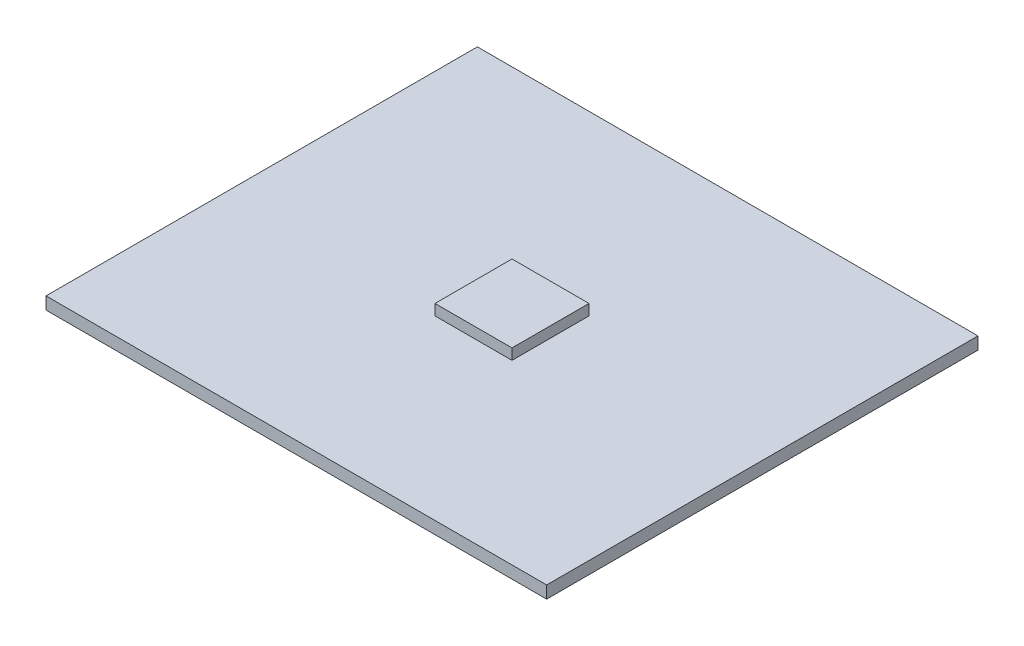
ISO-10303-21;
HEADER;
FILE_DESCRIPTION(('STEP AP214'),'2;1');
FILE_NAME('part.step','',(''),(''),'','','');
FILE_SCHEMA(('AUTOMOTIVE_DESIGN { 1 0 10303 214 1 1 1 1 }'));
ENDSEC;
DATA;
#1=APPLICATION_CONTEXT('core data for automotive mechanical design processes');
#2=APPLICATION_PROTOCOL_DEFINITION('international standard','automotive_design',2000,#1);
#3=PRODUCT_CONTEXT('',#1,'mechanical');
#4=PRODUCT('Part','Part','',(#3));
#5=PRODUCT_RELATED_PRODUCT_CATEGORY('part','',(#4));
#6=PRODUCT_DEFINITION_FORMATION('','',#4);
#7=PRODUCT_DEFINITION_CONTEXT('part definition',#1,'design');
#8=PRODUCT_DEFINITION('design','',#6,#7);
#9=PRODUCT_DEFINITION_SHAPE('','',#8);
#10=(LENGTH_UNIT() NAMED_UNIT(*) SI_UNIT(.MILLI.,.METRE.));
#11=(NAMED_UNIT(*) PLANE_ANGLE_UNIT() SI_UNIT($,.RADIAN.));
#12=(NAMED_UNIT(*) SI_UNIT($,.STERADIAN.) SOLID_ANGLE_UNIT());
#13=UNCERTAINTY_MEASURE_WITH_UNIT(LENGTH_MEASURE(1.E-05),#10,'distance_accuracy_value','');
#14=(GEOMETRIC_REPRESENTATION_CONTEXT(3) GLOBAL_UNCERTAINTY_ASSIGNED_CONTEXT((#13)) GLOBAL_UNIT_ASSIGNED_CONTEXT((#10,
#11,#12)) REPRESENTATION_CONTEXT('',''));
#15=CARTESIAN_POINT('',(0.,0.,0.));
#16=DIRECTION('',(0.,0.,1.));
#17=DIRECTION('',(1.,0.,0.));
#18=AXIS2_PLACEMENT_3D('',#15,#16,#17);
#19=CARTESIAN_POINT('',(0.,1.6,0.));
#20=DIRECTION('',(0.,1.,0.));
#21=DIRECTION('',(0.,0.,1.));
#22=AXIS2_PLACEMENT_3D('',#19,#20,#21);
#23=PLANE('',#22);
#24=DIRECTION('',(0.,0.,1.));
#25=VECTOR('',#24,1.);
#26=CARTESIAN_POINT('',(-32.5,1.6,-28.));
#27=LINE('',#26,#25);
#28=CARTESIAN_POINT('',(-32.5,1.6,-28.));
#29=VERTEX_POINT('',#28);
#30=CARTESIAN_POINT('',(-32.5,1.6,28.));
#31=VERTEX_POINT('',#30);
#32=EDGE_CURVE('E153',#29,#31,#27,.T.);
#33=ORIENTED_EDGE('',*,*,#32,.T.);
#34=DIRECTION('',(1.,0.,0.));
#35=VECTOR('',#34,1.);
#36=CARTESIAN_POINT('',(-32.5,1.6,28.));
#37=LINE('',#36,#35);
#38=CARTESIAN_POINT('',(32.5,1.6,28.));
#39=VERTEX_POINT('',#38);
#40=EDGE_CURVE('E91',#31,#39,#37,.T.);
#41=ORIENTED_EDGE('',*,*,#40,.T.);
#42=DIRECTION('',(0.,0.,-1.));
#43=VECTOR('',#42,1.);
#44=CARTESIAN_POINT('',(32.5,1.6,28.));
#45=LINE('',#44,#43);
#46=CARTESIAN_POINT('',(32.5,1.6,-28.));
#47=VERTEX_POINT('',#46);
#48=EDGE_CURVE('E152',#39,#47,#45,.T.);
#49=ORIENTED_EDGE('',*,*,#48,.T.);
#50=DIRECTION('',(-1.,0.,0.));
#51=VECTOR('',#50,1.);
#52=CARTESIAN_POINT('',(32.5,1.6,-28.));
#53=LINE('',#52,#51);
#54=EDGE_CURVE('E61',#47,#29,#53,.T.);
#55=ORIENTED_EDGE('',*,*,#54,.T.);
#56=EDGE_LOOP('',(#33,#41,#49,#55));
#57=FACE_BOUND('',#56,.T.);
#58=DIRECTION('',(-1.,0.,0.));
#59=VECTOR('',#58,1.);
#60=CARTESIAN_POINT('',(0.,1.6,5.));
#61=LINE('',#60,#59);
#62=CARTESIAN_POINT('',(5.,1.6,5.));
#63=VERTEX_POINT('',#62);
#64=CARTESIAN_POINT('',(-5.,1.6,5.));
#65=VERTEX_POINT('',#64);
#66=EDGE_CURVE('E150',#63,#65,#61,.T.);
#67=ORIENTED_EDGE('',*,*,#66,.T.);
#68=DIRECTION('',(0.,0.,-1.));
#69=VECTOR('',#68,1.);
#70=CARTESIAN_POINT('',(-5.,1.6,0.));
#71=LINE('',#70,#69);
#72=CARTESIAN_POINT('',(-5.,1.6,-5.));
#73=VERTEX_POINT('',#72);
#74=EDGE_CURVE('E136',#65,#73,#71,.T.);
#75=ORIENTED_EDGE('',*,*,#74,.T.);
#76=DIRECTION('',(1.,0.,0.));
#77=VECTOR('',#76,1.);
#78=CARTESIAN_POINT('',(0.,1.6,-5.));
#79=LINE('',#78,#77);
#80=CARTESIAN_POINT('',(5.,1.6,-5.));
#81=VERTEX_POINT('',#80);
#82=EDGE_CURVE('E140',#73,#81,#79,.T.);
#83=ORIENTED_EDGE('',*,*,#82,.T.);
#84=DIRECTION('',(0.,0.,1.));
#85=VECTOR('',#84,1.);
#86=CARTESIAN_POINT('',(5.,1.6,0.));
#87=LINE('',#86,#85);
#88=EDGE_CURVE('E139',#81,#63,#87,.T.);
#89=ORIENTED_EDGE('',*,*,#88,.T.);
#90=EDGE_LOOP('',(#67,#75,#83,#89));
#91=FACE_BOUND('',#90,.T.);
#92=ADVANCED_FACE('F39',(#57,#91),#23,.T.);
#93=CARTESIAN_POINT('',(-32.5,1.6,-28.));
#94=DIRECTION('',(1.,0.,0.));
#95=DIRECTION('',(0.,0.,-1.));
#96=AXIS2_PLACEMENT_3D('',#93,#94,#95);
#97=PLANE('',#96);
#98=DIRECTION('',(0.,0.,1.));
#99=VECTOR('',#98,1.);
#100=CARTESIAN_POINT('',(-32.5,0.,-28.));
#101=LINE('',#100,#99);
#102=CARTESIAN_POINT('',(-32.5,0.,-28.));
#103=VERTEX_POINT('',#102);
#104=CARTESIAN_POINT('',(-32.5,0.,28.));
#105=VERTEX_POINT('',#104);
#106=EDGE_CURVE('E148',#103,#105,#101,.T.);
#107=ORIENTED_EDGE('',*,*,#106,.T.);
#108=DIRECTION('',(0.,-1.,0.));
#109=VECTOR('',#108,1.);
#110=CARTESIAN_POINT('',(-32.5,1.6,28.));
#111=LINE('',#110,#109);
#112=EDGE_CURVE('E11',#31,#105,#111,.T.);
#113=ORIENTED_EDGE('',*,*,#112,.F.);
#114=ORIENTED_EDGE('',*,*,#32,.F.);
#115=DIRECTION('',(0.,-1.,0.));
#116=VECTOR('',#115,1.);
#117=CARTESIAN_POINT('',(-32.5,1.6,-28.));
#118=LINE('',#117,#116);
#119=EDGE_CURVE('E160',#29,#103,#118,.T.);
#120=ORIENTED_EDGE('',*,*,#119,.T.);
#121=EDGE_LOOP('',(#107,#113,#114,#120));
#122=FACE_BOUND('',#121,.T.);
#123=ADVANCED_FACE('F41',(#122),#97,.F.);
#124=CARTESIAN_POINT('',(-32.5,1.6,28.));
#125=DIRECTION('',(0.,0.,-1.));
#126=DIRECTION('',(-1.,0.,0.));
#127=AXIS2_PLACEMENT_3D('',#124,#125,#126);
#128=PLANE('',#127);
#129=DIRECTION('',(1.,0.,0.));
#130=VECTOR('',#129,1.);
#131=CARTESIAN_POINT('',(-32.5,0.,28.));
#132=LINE('',#131,#130);
#133=CARTESIAN_POINT('',(32.5,0.,28.));
#134=VERTEX_POINT('',#133);
#135=EDGE_CURVE('E158',#105,#134,#132,.T.);
#136=ORIENTED_EDGE('',*,*,#135,.T.);
#137=DIRECTION('',(0.,-1.,0.));
#138=VECTOR('',#137,1.);
#139=CARTESIAN_POINT('',(32.5,1.6,28.));
#140=LINE('',#139,#138);
#141=EDGE_CURVE('E50',#39,#134,#140,.T.);
#142=ORIENTED_EDGE('',*,*,#141,.F.);
#143=ORIENTED_EDGE('',*,*,#40,.F.);
#144=ORIENTED_EDGE('',*,*,#112,.T.);
#145=EDGE_LOOP('',(#136,#142,#143,#144));
#146=FACE_BOUND('',#145,.T.);
#147=ADVANCED_FACE('F187',(#146),#128,.F.);
#148=CARTESIAN_POINT('',(32.5,1.6,28.));
#149=DIRECTION('',(-1.,0.,0.));
#150=DIRECTION('',(0.,0.,1.));
#151=AXIS2_PLACEMENT_3D('',#148,#149,#150);
#152=PLANE('',#151);
#153=DIRECTION('',(0.,0.,-1.));
#154=VECTOR('',#153,1.);
#155=CARTESIAN_POINT('',(32.5,0.,28.));
#156=LINE('',#155,#154);
#157=CARTESIAN_POINT('',(32.5,0.,-28.));
#158=VERTEX_POINT('',#157);
#159=EDGE_CURVE('E165',#134,#158,#156,.T.);
#160=ORIENTED_EDGE('',*,*,#159,.T.);
#161=DIRECTION('',(0.,-1.,0.));
#162=VECTOR('',#161,1.);
#163=CARTESIAN_POINT('',(32.5,1.6,-28.));
#164=LINE('',#163,#162);
#165=EDGE_CURVE('E168',#47,#158,#164,.T.);
#166=ORIENTED_EDGE('',*,*,#165,.F.);
#167=ORIENTED_EDGE('',*,*,#48,.F.);
#168=ORIENTED_EDGE('',*,*,#141,.T.);
#169=EDGE_LOOP('',(#160,#166,#167,#168));
#170=FACE_BOUND('',#169,.T.);
#171=ADVANCED_FACE('F173',(#170),#152,.F.);
#172=CARTESIAN_POINT('',(32.5,1.6,-28.));
#173=DIRECTION('',(0.,0.,1.));
#174=DIRECTION('',(1.,0.,0.));
#175=AXIS2_PLACEMENT_3D('',#172,#173,#174);
#176=PLANE('',#175);
#177=DIRECTION('',(-1.,0.,0.));
#178=VECTOR('',#177,1.);
#179=CARTESIAN_POINT('',(32.5,0.,-28.));
#180=LINE('',#179,#178);
#181=EDGE_CURVE('E84',#158,#103,#180,.T.);
#182=ORIENTED_EDGE('',*,*,#181,.T.);
#183=ORIENTED_EDGE('',*,*,#119,.F.);
#184=ORIENTED_EDGE('',*,*,#54,.F.);
#185=ORIENTED_EDGE('',*,*,#165,.T.);
#186=EDGE_LOOP('',(#182,#183,#184,#185));
#187=FACE_BOUND('',#186,.T.);
#188=ADVANCED_FACE('F177',(#187),#176,.F.);
#189=CARTESIAN_POINT('',(0.,0.,0.));
#190=DIRECTION('',(0.,1.,0.));
#191=DIRECTION('',(0.,0.,1.));
#192=AXIS2_PLACEMENT_3D('',#189,#190,#191);
#193=PLANE('',#192);
#194=ORIENTED_EDGE('',*,*,#106,.F.);
#195=ORIENTED_EDGE('',*,*,#181,.F.);
#196=ORIENTED_EDGE('',*,*,#159,.F.);
#197=ORIENTED_EDGE('',*,*,#135,.F.);
#198=EDGE_LOOP('',(#194,#195,#196,#197));
#199=FACE_BOUND('',#198,.T.);
#200=ADVANCED_FACE('F172',(#199),#193,.F.);
#201=CARTESIAN_POINT('',(-5.,3.,-5.));
#202=DIRECTION('',(1.,0.,0.));
#203=DIRECTION('',(0.,0.,-1.));
#204=AXIS2_PLACEMENT_3D('',#201,#202,#203);
#205=PLANE('',#204);
#206=ORIENTED_EDGE('',*,*,#74,.F.);
#207=DIRECTION('',(0.,-1.,0.));
#208=VECTOR('',#207,1.);
#209=CARTESIAN_POINT('',(-5.,3.,5.));
#210=LINE('',#209,#208);
#211=CARTESIAN_POINT('',(-5.,3.,5.));
#212=VERTEX_POINT('',#211);
#213=EDGE_CURVE('E116',#212,#65,#210,.T.);
#214=ORIENTED_EDGE('',*,*,#213,.F.);
#215=DIRECTION('',(0.,0.,1.));
#216=VECTOR('',#215,1.);
#217=CARTESIAN_POINT('',(-5.,3.,-5.));
#218=LINE('',#217,#216);
#219=CARTESIAN_POINT('',(-5.,3.,-5.));
#220=VERTEX_POINT('',#219);
#221=EDGE_CURVE('E124',#220,#212,#218,.T.);
#222=ORIENTED_EDGE('',*,*,#221,.F.);
#223=DIRECTION('',(0.,-1.,0.));
#224=VECTOR('',#223,1.);
#225=CARTESIAN_POINT('',(-5.,3.,-5.));
#226=LINE('',#225,#224);
#227=EDGE_CURVE('E271',#220,#73,#226,.T.);
#228=ORIENTED_EDGE('',*,*,#227,.T.);
#229=EDGE_LOOP('',(#206,#214,#222,#228));
#230=FACE_BOUND('',#229,.T.);
#231=ADVANCED_FACE('F132',(#230),#205,.F.);
#232=CARTESIAN_POINT('',(-5.,3.,5.));
#233=DIRECTION('',(0.,0.,-1.));
#234=DIRECTION('',(-1.,0.,0.));
#235=AXIS2_PLACEMENT_3D('',#232,#233,#234);
#236=PLANE('',#235);
#237=ORIENTED_EDGE('',*,*,#66,.F.);
#238=DIRECTION('',(0.,-1.,0.));
#239=VECTOR('',#238,1.);
#240=CARTESIAN_POINT('',(5.,3.,5.));
#241=LINE('',#240,#239);
#242=CARTESIAN_POINT('',(5.,3.,5.));
#243=VERTEX_POINT('',#242);
#244=EDGE_CURVE('E123',#243,#63,#241,.T.);
#245=ORIENTED_EDGE('',*,*,#244,.F.);
#246=DIRECTION('',(1.,0.,0.));
#247=VECTOR('',#246,1.);
#248=CARTESIAN_POINT('',(-5.,3.,5.));
#249=LINE('',#248,#247);
#250=EDGE_CURVE('E114',#212,#243,#249,.T.);
#251=ORIENTED_EDGE('',*,*,#250,.F.);
#252=ORIENTED_EDGE('',*,*,#213,.T.);
#253=EDGE_LOOP('',(#237,#245,#251,#252));
#254=FACE_BOUND('',#253,.T.);
#255=ADVANCED_FACE('F118',(#254),#236,.F.);
#256=CARTESIAN_POINT('',(5.,3.,5.));
#257=DIRECTION('',(-1.,0.,0.));
#258=DIRECTION('',(0.,0.,1.));
#259=AXIS2_PLACEMENT_3D('',#256,#257,#258);
#260=PLANE('',#259);
#261=ORIENTED_EDGE('',*,*,#88,.F.);
#262=DIRECTION('',(0.,-1.,0.));
#263=VECTOR('',#262,1.);
#264=CARTESIAN_POINT('',(5.,3.,-5.));
#265=LINE('',#264,#263);
#266=CARTESIAN_POINT('',(5.,3.,-5.));
#267=VERTEX_POINT('',#266);
#268=EDGE_CURVE('E53',#267,#81,#265,.T.);
#269=ORIENTED_EDGE('',*,*,#268,.F.);
#270=DIRECTION('',(0.,0.,-1.));
#271=VECTOR('',#270,1.);
#272=CARTESIAN_POINT('',(5.,3.,5.));
#273=LINE('',#272,#271);
#274=EDGE_CURVE('E125',#243,#267,#273,.T.);
#275=ORIENTED_EDGE('',*,*,#274,.F.);
#276=ORIENTED_EDGE('',*,*,#244,.T.);
#277=EDGE_LOOP('',(#261,#269,#275,#276));
#278=FACE_BOUND('',#277,.T.);
#279=ADVANCED_FACE('F199',(#278),#260,.F.);
#280=CARTESIAN_POINT('',(5.,3.,-5.));
#281=DIRECTION('',(0.,0.,1.));
#282=DIRECTION('',(1.,0.,0.));
#283=AXIS2_PLACEMENT_3D('',#280,#281,#282);
#284=PLANE('',#283);
#285=ORIENTED_EDGE('',*,*,#82,.F.);
#286=ORIENTED_EDGE('',*,*,#227,.F.);
#287=DIRECTION('',(-1.,0.,0.));
#288=VECTOR('',#287,1.);
#289=CARTESIAN_POINT('',(5.,3.,-5.));
#290=LINE('',#289,#288);
#291=EDGE_CURVE('E129',#267,#220,#290,.T.);
#292=ORIENTED_EDGE('',*,*,#291,.F.);
#293=ORIENTED_EDGE('',*,*,#268,.T.);
#294=EDGE_LOOP('',(#285,#286,#292,#293));
#295=FACE_BOUND('',#294,.T.);
#296=ADVANCED_FACE('F201',(#295),#284,.F.);
#297=CARTESIAN_POINT('',(0.,3.,0.));
#298=DIRECTION('',(0.,1.,0.));
#299=DIRECTION('',(0.,0.,1.));
#300=AXIS2_PLACEMENT_3D('',#297,#298,#299);
#301=PLANE('',#300);
#302=ORIENTED_EDGE('',*,*,#221,.T.);
#303=ORIENTED_EDGE('',*,*,#250,.T.);
#304=ORIENTED_EDGE('',*,*,#274,.T.);
#305=ORIENTED_EDGE('',*,*,#291,.T.);
#306=EDGE_LOOP('',(#302,#303,#304,#305));
#307=FACE_BOUND('',#306,.T.);
#308=ADVANCED_FACE('F126',(#307),#301,.T.);
#309=CLOSED_SHELL('',(#92,#123,#147,#171,#188,#200,#231,#255,#279,#296,#308));
#310=MANIFOLD_SOLID_BREP('B2',#309);
#311=ADVANCED_BREP_SHAPE_REPRESENTATION('',(#18,#310),#14);
#312=SHAPE_DEFINITION_REPRESENTATION(#9,#311);
ENDSEC;
END-ISO-10303-21;
